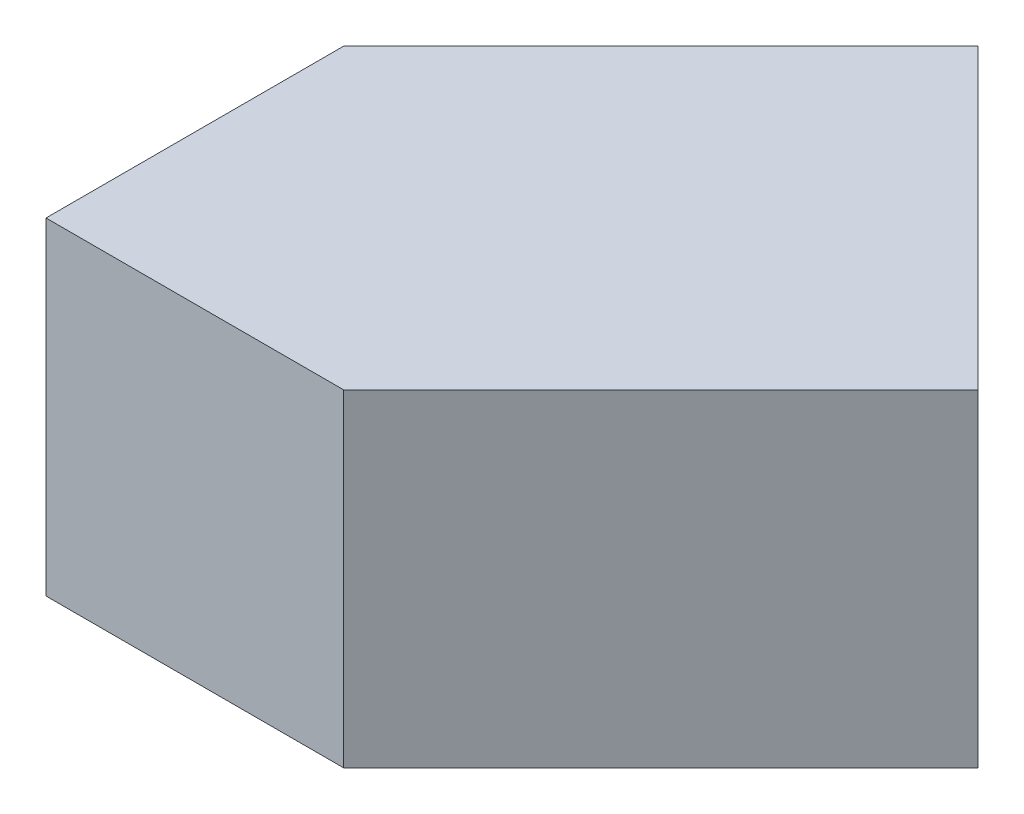
ISO-10303-21;
HEADER;
FILE_DESCRIPTION(('STEP AP214'),'2;1');
FILE_NAME('part.step','',(''),(''),'','','');
FILE_SCHEMA(('AUTOMOTIVE_DESIGN { 1 0 10303 214 1 1 1 1 }'));
ENDSEC;
DATA;
#1=APPLICATION_CONTEXT('core data for automotive mechanical design processes');
#2=APPLICATION_PROTOCOL_DEFINITION('international standard','automotive_design',2000,#1);
#3=PRODUCT_CONTEXT('',#1,'mechanical');
#4=PRODUCT('Part','Part','',(#3));
#5=PRODUCT_RELATED_PRODUCT_CATEGORY('part','',(#4));
#6=PRODUCT_DEFINITION_FORMATION('','',#4);
#7=PRODUCT_DEFINITION_CONTEXT('part definition',#1,'design');
#8=PRODUCT_DEFINITION('design','',#6,#7);
#9=PRODUCT_DEFINITION_SHAPE('','',#8);
#10=(LENGTH_UNIT() NAMED_UNIT(*) SI_UNIT(.MILLI.,.METRE.));
#11=(NAMED_UNIT(*) PLANE_ANGLE_UNIT() SI_UNIT($,.RADIAN.));
#12=(NAMED_UNIT(*) SI_UNIT($,.STERADIAN.) SOLID_ANGLE_UNIT());
#13=UNCERTAINTY_MEASURE_WITH_UNIT(LENGTH_MEASURE(1.E-05),#10,'distance_accuracy_value','');
#14=(GEOMETRIC_REPRESENTATION_CONTEXT(3) GLOBAL_UNCERTAINTY_ASSIGNED_CONTEXT((#13)) GLOBAL_UNIT_ASSIGNED_CONTEXT((#10,
#11,#12)) REPRESENTATION_CONTEXT('',''));
#15=CARTESIAN_POINT('',(0.,0.,0.));
#16=DIRECTION('',(0.,0.,1.));
#17=DIRECTION('',(1.,0.,0.));
#18=AXIS2_PLACEMENT_3D('',#15,#16,#17);
#19=CARTESIAN_POINT('',(33.7839141137151,23.85,-19.5003571337468));
#20=DIRECTION('',(0.,1.,0.));
#21=DIRECTION('',(0.,0.,1.));
#22=AXIS2_PLACEMENT_3D('',#19,#20,#21);
#23=PLANE('',#22);
#24=DIRECTION('',(1.,0.,0.));
#25=VECTOR('',#24,1.);
#26=CARTESIAN_POINT('',(-10.1,23.85,-10.1));
#27=LINE('',#26,#25);
#28=CARTESIAN_POINT('',(-10.1,23.85,-10.1));
#29=VERTEX_POINT('',#28);
#30=CARTESIAN_POINT('',(10.1,23.85,-10.1));
#31=VERTEX_POINT('',#30);
#32=EDGE_CURVE('E166',#29,#31,#27,.T.);
#33=ORIENTED_EDGE('',*,*,#32,.T.);
#34=DIRECTION('',(0.,0.,-1.));
#35=VECTOR('',#34,1.);
#36=CARTESIAN_POINT('',(10.1,23.85,10.1));
#37=LINE('',#36,#35);
#38=CARTESIAN_POINT('',(10.1,23.85,10.1));
#39=VERTEX_POINT('',#38);
#40=EDGE_CURVE('E162',#39,#31,#37,.T.);
#41=ORIENTED_EDGE('',*,*,#40,.F.);
#42=DIRECTION('',(1.,0.,0.));
#43=VECTOR('',#42,1.);
#44=CARTESIAN_POINT('',(-10.1,23.85,10.1));
#45=LINE('',#44,#43);
#46=CARTESIAN_POINT('',(-10.1,23.85,10.1));
#47=VERTEX_POINT('',#46);
#48=EDGE_CURVE('E151',#47,#39,#45,.T.);
#49=ORIENTED_EDGE('',*,*,#48,.F.);
#50=DIRECTION('',(0.,0.,-1.));
#51=VECTOR('',#50,1.);
#52=CARTESIAN_POINT('',(-10.1,23.85,10.1));
#53=LINE('',#52,#51);
#54=EDGE_CURVE('E161',#47,#29,#53,.T.);
#55=ORIENTED_EDGE('',*,*,#54,.T.);
#56=EDGE_LOOP('',(#33,#41,#49,#55));
#57=FACE_BOUND('',#56,.T.);
#58=ADVANCED_FACE('F36',(#57),#23,.F.);
#59=DIRECTION('',(-0.707106781186548,0.,-0.707106781186548));
#60=VECTOR('',#59,1.);
#61=CARTESIAN_POINT('',(19.6417784899841,23.85,-5.35822151001587));
#62=LINE('',#61,#60);
#63=CARTESIAN_POINT('',(19.6417784899841,23.85,-5.35822151001587));
#64=VERTEX_POINT('',#63);
#65=CARTESIAN_POINT('',(5.35822151001588,23.85,-19.6417784899841));
#66=VERTEX_POINT('',#65);
#67=EDGE_CURVE('E148',#64,#66,#62,.T.);
#68=ORIENTED_EDGE('',*,*,#67,.T.);
#69=DIRECTION('',(-0.707106781186548,0.,0.707106781186548));
#70=VECTOR('',#69,1.);
#71=CARTESIAN_POINT('',(19.5003571337468,23.85,-33.7839141137151));
#72=LINE('',#71,#70);
#73=CARTESIAN_POINT('',(19.5003571337468,23.85,-33.7839141137151));
#74=VERTEX_POINT('',#73);
#75=EDGE_CURVE('E134',#74,#66,#72,.T.);
#76=ORIENTED_EDGE('',*,*,#75,.F.);
#77=DIRECTION('',(-0.707106781186547,0.,-0.707106781186547));
#78=VECTOR('',#77,1.);
#79=CARTESIAN_POINT('',(33.7839141137151,23.85,-19.5003571337468));
#80=LINE('',#79,#78);
#81=CARTESIAN_POINT('',(33.7839141137151,23.85,-19.5003571337468));
#82=VERTEX_POINT('',#81);
#83=EDGE_CURVE('E181',#82,#74,#80,.T.);
#84=ORIENTED_EDGE('',*,*,#83,.F.);
#85=DIRECTION('',(-0.707106781186548,0.,0.707106781186548));
#86=VECTOR('',#85,1.);
#87=CARTESIAN_POINT('',(33.7839141137151,23.85,-19.5003571337468));
#88=LINE('',#87,#86);
#89=EDGE_CURVE('E145',#82,#64,#88,.T.);
#90=ORIENTED_EDGE('',*,*,#89,.T.);
#91=EDGE_LOOP('',(#68,#76,#84,#90));
#92=FACE_BOUND('',#91,.T.);
#93=ADVANCED_FACE('F149',(#92),#23,.F.);
#94=CARTESIAN_POINT('',(33.7839141137151,3.65,-19.5003571337468));
#95=DIRECTION('',(0.,-1.,0.));
#96=DIRECTION('',(0.,0.,-1.));
#97=AXIS2_PLACEMENT_3D('',#94,#95,#96);
#98=PLANE('',#97);
#99=DIRECTION('',(-0.707106781186547,0.,-0.707106781186547));
#100=VECTOR('',#99,1.);
#101=CARTESIAN_POINT('',(19.6417784899841,3.65,-5.35822151001587));
#102=LINE('',#101,#100);
#103=CARTESIAN_POINT('',(19.6417784899841,3.65,-5.35822151001586));
#104=VERTEX_POINT('',#103);
#105=CARTESIAN_POINT('',(5.35822151001588,3.65,-19.6417784899841));
#106=VERTEX_POINT('',#105);
#107=EDGE_CURVE('E53',#104,#106,#102,.T.);
#108=ORIENTED_EDGE('',*,*,#107,.F.);
#109=DIRECTION('',(-0.707106781186548,0.,0.707106781186548));
#110=VECTOR('',#109,1.);
#111=CARTESIAN_POINT('',(33.7839141137151,3.65,-19.5003571337468));
#112=LINE('',#111,#110);
#113=CARTESIAN_POINT('',(33.7839141137151,3.65,-19.5003571337468));
#114=VERTEX_POINT('',#113);
#115=EDGE_CURVE('E185',#114,#104,#112,.T.);
#116=ORIENTED_EDGE('',*,*,#115,.F.);
#117=DIRECTION('',(0.707106781186547,0.,0.707106781186547));
#118=VECTOR('',#117,1.);
#119=CARTESIAN_POINT('',(33.7839141137151,3.65,-19.5003571337468));
#120=LINE('',#119,#118);
#121=CARTESIAN_POINT('',(19.5003571337468,3.65,-33.7839141137151));
#122=VERTEX_POINT('',#121);
#123=EDGE_CURVE('E175',#122,#114,#120,.T.);
#124=ORIENTED_EDGE('',*,*,#123,.F.);
#125=DIRECTION('',(-0.707106781186548,0.,0.707106781186548));
#126=VECTOR('',#125,1.);
#127=CARTESIAN_POINT('',(19.5003571337468,3.65,-33.7839141137151));
#128=LINE('',#127,#126);
#129=EDGE_CURVE('E182',#122,#106,#128,.T.);
#130=ORIENTED_EDGE('',*,*,#129,.T.);
#131=EDGE_LOOP('',(#108,#116,#124,#130));
#132=FACE_BOUND('',#131,.T.);
#133=ADVANCED_FACE('F268',(#132),#98,.F.);
#134=CARTESIAN_POINT('',(33.7839141137151,3.65,-19.5003571337468));
#135=DIRECTION('',(0.707106781186548,0.,0.707106781186548));
#136=DIRECTION('',(0.707106781186548,0.,-0.707106781186548));
#137=AXIS2_PLACEMENT_3D('',#134,#135,#136);
#138=PLANE('',#137);
#139=DIRECTION('',(0.,-1.,0.));
#140=VECTOR('',#139,1.);
#141=CARTESIAN_POINT('',(19.6417784899841,27.502,-5.35822151001587));
#142=LINE('',#141,#140);
#143=EDGE_CURVE('E60',#64,#104,#142,.T.);
#144=ORIENTED_EDGE('',*,*,#143,.F.);
#145=ORIENTED_EDGE('',*,*,#89,.F.);
#146=DIRECTION('',(0.,1.,0.));
#147=VECTOR('',#146,1.);
#148=CARTESIAN_POINT('',(33.7839141137151,3.65,-19.5003571337468));
#149=LINE('',#148,#147);
#150=EDGE_CURVE('E178',#114,#82,#149,.T.);
#151=ORIENTED_EDGE('',*,*,#150,.F.);
#152=ORIENTED_EDGE('',*,*,#115,.T.);
#153=EDGE_LOOP('',(#144,#145,#151,#152));
#154=FACE_BOUND('',#153,.T.);
#155=ADVANCED_FACE('F261',(#154),#138,.F.);
#156=CARTESIAN_POINT('',(19.5003571337468,3.65,-33.7839141137151));
#157=DIRECTION('',(-0.707106781186548,0.,-0.707106781186548));
#158=DIRECTION('',(-0.707106781186548,0.,0.707106781186548));
#159=AXIS2_PLACEMENT_3D('',#156,#157,#158);
#160=PLANE('',#159);
#161=DIRECTION('',(0.,-1.,0.));
#162=VECTOR('',#161,1.);
#163=CARTESIAN_POINT('',(5.35822151001588,27.502,-19.6417784899841));
#164=LINE('',#163,#162);
#165=EDGE_CURVE('E138',#66,#106,#164,.T.);
#166=ORIENTED_EDGE('',*,*,#165,.T.);
#167=ORIENTED_EDGE('',*,*,#129,.F.);
#168=DIRECTION('',(0.,-1.,0.));
#169=VECTOR('',#168,1.);
#170=CARTESIAN_POINT('',(19.5003571337468,3.65,-33.7839141137151));
#171=LINE('',#170,#169);
#172=EDGE_CURVE('E140',#74,#122,#171,.T.);
#173=ORIENTED_EDGE('',*,*,#172,.F.);
#174=ORIENTED_EDGE('',*,*,#75,.T.);
#175=EDGE_LOOP('',(#166,#167,#173,#174));
#176=FACE_BOUND('',#175,.T.);
#177=ADVANCED_FACE('F136',(#176),#160,.F.);
#178=CARTESIAN_POINT('',(10.1,20.,0.));
#179=DIRECTION('',(-1.,0.,0.));
#180=DIRECTION('',(0.,0.,1.));
#181=AXIS2_PLACEMENT_3D('',#178,#179,#180);
#182=PLANE('',#181);
#183=ORIENTED_EDGE('',*,*,#40,.T.);
#184=DIRECTION('',(0.,-1.,0.));
#185=VECTOR('',#184,1.);
#186=CARTESIAN_POINT('',(10.1,20.,-10.1));
#187=LINE('',#186,#185);
#188=CARTESIAN_POINT('',(10.1,0.,-10.1));
#189=VERTEX_POINT('',#188);
#190=EDGE_CURVE('E225',#31,#189,#187,.T.);
#191=ORIENTED_EDGE('',*,*,#190,.T.);
#192=DIRECTION('',(0.,0.,-1.));
#193=VECTOR('',#192,1.);
#194=CARTESIAN_POINT('',(10.1,0.,10.1));
#195=LINE('',#194,#193);
#196=CARTESIAN_POINT('',(10.1,0.,10.1));
#197=VERTEX_POINT('',#196);
#198=EDGE_CURVE('E163',#197,#189,#195,.T.);
#199=ORIENTED_EDGE('',*,*,#198,.F.);
#200=DIRECTION('',(0.,-1.,0.));
#201=VECTOR('',#200,1.);
#202=CARTESIAN_POINT('',(10.1,20.,10.1));
#203=LINE('',#202,#201);
#204=EDGE_CURVE('E40',#39,#197,#203,.T.);
#205=ORIENTED_EDGE('',*,*,#204,.F.);
#206=EDGE_LOOP('',(#183,#191,#199,#205));
#207=FACE_BOUND('',#206,.T.);
#208=ADVANCED_FACE('F38',(#207),#182,.T.);
#209=CARTESIAN_POINT('',(0.,20.,12.5));
#210=DIRECTION('',(0.,0.,-1.));
#211=DIRECTION('',(-1.,0.,0.));
#212=AXIS2_PLACEMENT_3D('',#209,#210,#211);
#213=PLANE('',#212);
#214=DIRECTION('',(1.,0.,0.));
#215=VECTOR('',#214,1.);
#216=CARTESIAN_POINT('',(0.,0.,12.5));
#217=LINE('',#216,#215);
#218=CARTESIAN_POINT('',(-12.5,0.,12.5));
#219=VERTEX_POINT('',#218);
#220=CARTESIAN_POINT('',(12.5,0.,12.5));
#221=VERTEX_POINT('',#220);
#222=EDGE_CURVE('E219',#219,#221,#217,.T.);
#223=ORIENTED_EDGE('',*,*,#222,.T.);
#224=DIRECTION('',(0.,-1.,0.));
#225=VECTOR('',#224,1.);
#226=CARTESIAN_POINT('',(12.5,20.,12.5));
#227=LINE('',#226,#225);
#228=CARTESIAN_POINT('',(12.5,27.5,12.5));
#229=VERTEX_POINT('',#228);
#230=EDGE_CURVE('E11',#229,#221,#227,.T.);
#231=ORIENTED_EDGE('',*,*,#230,.F.);
#232=DIRECTION('',(1.,0.,0.));
#233=VECTOR('',#232,1.);
#234=CARTESIAN_POINT('',(-12.5,27.5,12.5));
#235=LINE('',#234,#233);
#236=CARTESIAN_POINT('',(-12.5,27.5,12.5));
#237=VERTEX_POINT('',#236);
#238=EDGE_CURVE('E210',#237,#229,#235,.T.);
#239=ORIENTED_EDGE('',*,*,#238,.F.);
#240=DIRECTION('',(0.,-1.,0.));
#241=VECTOR('',#240,1.);
#242=CARTESIAN_POINT('',(-12.5,20.,12.5));
#243=LINE('',#242,#241);
#244=EDGE_CURVE('E226',#237,#219,#243,.T.);
#245=ORIENTED_EDGE('',*,*,#244,.T.);
#246=EDGE_LOOP('',(#223,#231,#239,#245));
#247=FACE_BOUND('',#246,.T.);
#248=ADVANCED_FACE('F254',(#247),#213,.F.);
#249=CARTESIAN_POINT('',(0.,20.,10.1));
#250=DIRECTION('',(0.,0.,-1.));
#251=DIRECTION('',(-1.,0.,0.));
#252=AXIS2_PLACEMENT_3D('',#249,#250,#251);
#253=PLANE('',#252);
#254=DIRECTION('',(1.,0.,0.));
#255=VECTOR('',#254,1.);
#256=CARTESIAN_POINT('',(0.,0.,10.1));
#257=LINE('',#256,#255);
#258=CARTESIAN_POINT('',(-10.1,0.,10.1));
#259=VERTEX_POINT('',#258);
#260=EDGE_CURVE('E213',#259,#197,#257,.T.);
#261=ORIENTED_EDGE('',*,*,#260,.F.);
#262=DIRECTION('',(0.,-1.,0.));
#263=VECTOR('',#262,1.);
#264=CARTESIAN_POINT('',(-10.1,20.,10.1));
#265=LINE('',#264,#263);
#266=EDGE_CURVE('E232',#47,#259,#265,.T.);
#267=ORIENTED_EDGE('',*,*,#266,.F.);
#268=ORIENTED_EDGE('',*,*,#48,.T.);
#269=ORIENTED_EDGE('',*,*,#204,.T.);
#270=EDGE_LOOP('',(#261,#267,#268,#269));
#271=FACE_BOUND('',#270,.T.);
#272=ADVANCED_FACE('F239',(#271),#253,.T.);
#273=CARTESIAN_POINT('',(-10.1,20.,0.));
#274=DIRECTION('',(-1.,0.,0.));
#275=DIRECTION('',(0.,0.,1.));
#276=AXIS2_PLACEMENT_3D('',#273,#274,#275);
#277=PLANE('',#276);
#278=DIRECTION('',(0.,0.,-1.));
#279=VECTOR('',#278,1.);
#280=CARTESIAN_POINT('',(-10.1,0.,0.));
#281=LINE('',#280,#279);
#282=CARTESIAN_POINT('',(-10.1,0.,-10.1));
#283=VERTEX_POINT('',#282);
#284=EDGE_CURVE('E216',#259,#283,#281,.T.);
#285=ORIENTED_EDGE('',*,*,#284,.T.);
#286=DIRECTION('',(0.,-1.,0.));
#287=VECTOR('',#286,1.);
#288=CARTESIAN_POINT('',(-10.1,20.,-10.1));
#289=LINE('',#288,#287);
#290=EDGE_CURVE('E231',#29,#283,#289,.T.);
#291=ORIENTED_EDGE('',*,*,#290,.F.);
#292=ORIENTED_EDGE('',*,*,#54,.F.);
#293=ORIENTED_EDGE('',*,*,#266,.T.);
#294=EDGE_LOOP('',(#285,#291,#292,#293));
#295=FACE_BOUND('',#294,.T.);
#296=ADVANCED_FACE('F247',(#295),#277,.F.);
#297=CARTESIAN_POINT('',(-12.5,20.,0.));
#298=DIRECTION('',(-1.,0.,0.));
#299=DIRECTION('',(0.,0.,1.));
#300=AXIS2_PLACEMENT_3D('',#297,#298,#299);
#301=PLANE('',#300);
#302=DIRECTION('',(0.,0.,-1.));
#303=VECTOR('',#302,1.);
#304=CARTESIAN_POINT('',(-12.5,0.,0.));
#305=LINE('',#304,#303);
#306=CARTESIAN_POINT('',(-12.5,0.,-12.5));
#307=VERTEX_POINT('',#306);
#308=EDGE_CURVE('E222',#219,#307,#305,.T.);
#309=ORIENTED_EDGE('',*,*,#308,.F.);
#310=ORIENTED_EDGE('',*,*,#244,.F.);
#311=DIRECTION('',(0.,0.,1.));
#312=VECTOR('',#311,1.);
#313=CARTESIAN_POINT('',(-12.5,27.5,-12.5));
#314=LINE('',#313,#312);
#315=CARTESIAN_POINT('',(-12.5,27.5,-12.5));
#316=VERTEX_POINT('',#315);
#317=EDGE_CURVE('E202',#316,#237,#314,.T.);
#318=ORIENTED_EDGE('',*,*,#317,.F.);
#319=DIRECTION('',(0.,-1.,0.));
#320=VECTOR('',#319,1.);
#321=CARTESIAN_POINT('',(-12.5,20.,-12.5));
#322=LINE('',#321,#320);
#323=EDGE_CURVE('E45',#316,#307,#322,.T.);
#324=ORIENTED_EDGE('',*,*,#323,.T.);
#325=EDGE_LOOP('',(#309,#310,#318,#324));
#326=FACE_BOUND('',#325,.T.);
#327=ADVANCED_FACE('F293',(#326),#301,.T.);
#328=CARTESIAN_POINT('',(0.,0.,0.));
#329=DIRECTION('',(0.,1.,0.));
#330=DIRECTION('',(0.,0.,1.));
#331=AXIS2_PLACEMENT_3D('',#328,#329,#330);
#332=PLANE('',#331);
#333=ORIENTED_EDGE('',*,*,#198,.T.);
#334=DIRECTION('',(1.,0.,0.));
#335=VECTOR('',#334,1.);
#336=CARTESIAN_POINT('',(-10.1,0.,-10.1));
#337=LINE('',#336,#335);
#338=EDGE_CURVE('E158',#283,#189,#337,.T.);
#339=ORIENTED_EDGE('',*,*,#338,.F.);
#340=ORIENTED_EDGE('',*,*,#284,.F.);
#341=ORIENTED_EDGE('',*,*,#260,.T.);
#342=EDGE_LOOP('',(#333,#339,#340,#341));
#343=FACE_BOUND('',#342,.T.);
#344=ORIENTED_EDGE('',*,*,#308,.T.);
#345=DIRECTION('',(-0.707106781186548,0.,0.707106781186548));
#346=VECTOR('',#345,1.);
#347=CARTESIAN_POINT('',(14.142135623731,0.,-39.142135623731));
#348=LINE('',#347,#346);
#349=CARTESIAN_POINT('',(14.142135623731,0.,-39.142135623731));
#350=VERTEX_POINT('',#349);
#351=EDGE_CURVE('E199',#350,#307,#348,.T.);
#352=ORIENTED_EDGE('',*,*,#351,.F.);
#353=DIRECTION('',(0.707106781186547,0.,0.707106781186547));
#354=VECTOR('',#353,1.);
#355=CARTESIAN_POINT('',(39.142135623731,0.,-14.142135623731));
#356=LINE('',#355,#354);
#357=CARTESIAN_POINT('',(39.142135623731,0.,-14.142135623731));
#358=VERTEX_POINT('',#357);
#359=EDGE_CURVE('E190',#350,#358,#356,.T.);
#360=ORIENTED_EDGE('',*,*,#359,.T.);
#361=DIRECTION('',(-0.707106781186548,0.,0.707106781186548));
#362=VECTOR('',#361,1.);
#363=CARTESIAN_POINT('',(39.142135623731,0.,-14.142135623731));
#364=LINE('',#363,#362);
#365=EDGE_CURVE('E205',#358,#221,#364,.T.);
#366=ORIENTED_EDGE('',*,*,#365,.T.);
#367=ORIENTED_EDGE('',*,*,#222,.F.);
#368=EDGE_LOOP('',(#344,#352,#360,#366,#367));
#369=FACE_BOUND('',#368,.T.);
#370=ADVANCED_FACE('F244',(#343,#369),#332,.F.);
#371=CARTESIAN_POINT('',(0.,27.5,0.));
#372=DIRECTION('',(0.,1.,0.));
#373=DIRECTION('',(0.,0.,1.));
#374=AXIS2_PLACEMENT_3D('',#371,#372,#373);
#375=PLANE('',#374);
#376=ORIENTED_EDGE('',*,*,#238,.T.);
#377=DIRECTION('',(-0.707106781186548,0.,0.707106781186548));
#378=VECTOR('',#377,1.);
#379=CARTESIAN_POINT('',(39.142135623731,27.5,-14.142135623731));
#380=LINE('',#379,#378);
#381=CARTESIAN_POINT('',(39.142135623731,27.5,-14.142135623731));
#382=VERTEX_POINT('',#381);
#383=EDGE_CURVE('E203',#382,#229,#380,.T.);
#384=ORIENTED_EDGE('',*,*,#383,.F.);
#385=DIRECTION('',(-0.707106781186547,0.,-0.707106781186547));
#386=VECTOR('',#385,1.);
#387=CARTESIAN_POINT('',(39.142135623731,27.5,-14.142135623731));
#388=LINE('',#387,#386);
#389=CARTESIAN_POINT('',(14.142135623731,27.5,-39.142135623731));
#390=VERTEX_POINT('',#389);
#391=EDGE_CURVE('E196',#382,#390,#388,.T.);
#392=ORIENTED_EDGE('',*,*,#391,.T.);
#393=DIRECTION('',(-0.707106781186548,0.,0.707106781186548));
#394=VECTOR('',#393,1.);
#395=CARTESIAN_POINT('',(14.142135623731,27.5,-39.142135623731));
#396=LINE('',#395,#394);
#397=EDGE_CURVE('E200',#390,#316,#396,.T.);
#398=ORIENTED_EDGE('',*,*,#397,.T.);
#399=ORIENTED_EDGE('',*,*,#317,.T.);
#400=EDGE_LOOP('',(#376,#384,#392,#398,#399));
#401=FACE_BOUND('',#400,.T.);
#402=ADVANCED_FACE('F286',(#401),#375,.T.);
#403=CARTESIAN_POINT('',(14.142135623731,0.,-39.142135623731));
#404=DIRECTION('',(-0.707106781186548,0.,-0.707106781186548));
#405=DIRECTION('',(-0.707106781186548,0.,0.707106781186548));
#406=AXIS2_PLACEMENT_3D('',#403,#404,#405);
#407=PLANE('',#406);
#408=ORIENTED_EDGE('',*,*,#351,.T.);
#409=ORIENTED_EDGE('',*,*,#323,.F.);
#410=ORIENTED_EDGE('',*,*,#397,.F.);
#411=DIRECTION('',(0.,-1.,0.));
#412=VECTOR('',#411,1.);
#413=CARTESIAN_POINT('',(14.142135623731,0.,-39.142135623731));
#414=LINE('',#413,#412);
#415=EDGE_CURVE('E144',#390,#350,#414,.T.);
#416=ORIENTED_EDGE('',*,*,#415,.T.);
#417=EDGE_LOOP('',(#408,#409,#410,#416));
#418=FACE_BOUND('',#417,.T.);
#419=ADVANCED_FACE('F282',(#418),#407,.T.);
#420=CARTESIAN_POINT('',(39.142135623731,0.,-14.142135623731));
#421=DIRECTION('',(0.707106781186548,0.,0.707106781186548));
#422=DIRECTION('',(0.707106781186548,0.,-0.707106781186548));
#423=AXIS2_PLACEMENT_3D('',#420,#421,#422);
#424=PLANE('',#423);
#425=ORIENTED_EDGE('',*,*,#383,.T.);
#426=ORIENTED_EDGE('',*,*,#230,.T.);
#427=ORIENTED_EDGE('',*,*,#365,.F.);
#428=DIRECTION('',(0.,1.,0.));
#429=VECTOR('',#428,1.);
#430=CARTESIAN_POINT('',(39.142135623731,0.,-14.142135623731));
#431=LINE('',#430,#429);
#432=EDGE_CURVE('E193',#358,#382,#431,.T.);
#433=ORIENTED_EDGE('',*,*,#432,.T.);
#434=EDGE_LOOP('',(#425,#426,#427,#433));
#435=FACE_BOUND('',#434,.T.);
#436=ADVANCED_FACE('F278',(#435),#424,.T.);
#437=CARTESIAN_POINT('',(26.642135623731,0.,-26.642135623731));
#438=DIRECTION('',(-0.707106781186548,0.,0.707106781186548));
#439=DIRECTION('',(0.707106781186548,0.,0.707106781186548));
#440=AXIS2_PLACEMENT_3D('',#437,#438,#439);
#441=PLANE('',#440);
#442=ORIENTED_EDGE('',*,*,#83,.T.);
#443=ORIENTED_EDGE('',*,*,#172,.T.);
#444=ORIENTED_EDGE('',*,*,#123,.T.);
#445=ORIENTED_EDGE('',*,*,#150,.T.);
#446=EDGE_LOOP('',(#442,#443,#444,#445));
#447=FACE_BOUND('',#446,.T.);
#448=ORIENTED_EDGE('',*,*,#415,.F.);
#449=ORIENTED_EDGE('',*,*,#391,.F.);
#450=ORIENTED_EDGE('',*,*,#432,.F.);
#451=ORIENTED_EDGE('',*,*,#359,.F.);
#452=EDGE_LOOP('',(#448,#449,#450,#451));
#453=FACE_BOUND('',#452,.T.);
#454=ADVANCED_FACE('F275',(#447,#453),#441,.F.);
#455=CARTESIAN_POINT('',(0.,20.,-10.1));
#456=DIRECTION('',(0.,0.,-1.));
#457=DIRECTION('',(-1.,0.,0.));
#458=AXIS2_PLACEMENT_3D('',#455,#456,#457);
#459=PLANE('',#458);
#460=ORIENTED_EDGE('',*,*,#190,.F.);
#461=ORIENTED_EDGE('',*,*,#32,.F.);
#462=ORIENTED_EDGE('',*,*,#290,.T.);
#463=ORIENTED_EDGE('',*,*,#338,.T.);
#464=EDGE_LOOP('',(#460,#461,#462,#463));
#465=FACE_BOUND('',#464,.T.);
#466=ADVANCED_FACE('F251',(#465),#459,.F.);
#467=CARTESIAN_POINT('',(19.6417784899841,27.502,-5.35822151001587));
#468=DIRECTION('',(-0.707106781186548,0.,0.707106781186548));
#469=DIRECTION('',(0.707106781186548,0.,0.707106781186548));
#470=AXIS2_PLACEMENT_3D('',#467,#468,#469);
#471=PLANE('',#470);
#472=ORIENTED_EDGE('',*,*,#67,.F.);
#473=ORIENTED_EDGE('',*,*,#143,.T.);
#474=ORIENTED_EDGE('',*,*,#107,.T.);
#475=ORIENTED_EDGE('',*,*,#165,.F.);
#476=EDGE_LOOP('',(#472,#473,#474,#475));
#477=FACE_BOUND('',#476,.T.);
#478=ADVANCED_FACE('F153',(#477),#471,.F.);
#479=CLOSED_SHELL('',(#58,#93,#133,#155,#177,#208,#248,#272,#296,#327,#370,#402,#419,#436,#454,
#466,#478));
#480=MANIFOLD_SOLID_BREP('B2',#479);
#481=ADVANCED_BREP_SHAPE_REPRESENTATION('',(#18,#480),#14);
#482=SHAPE_DEFINITION_REPRESENTATION(#9,#481);
ENDSEC;
END-ISO-10303-21;
